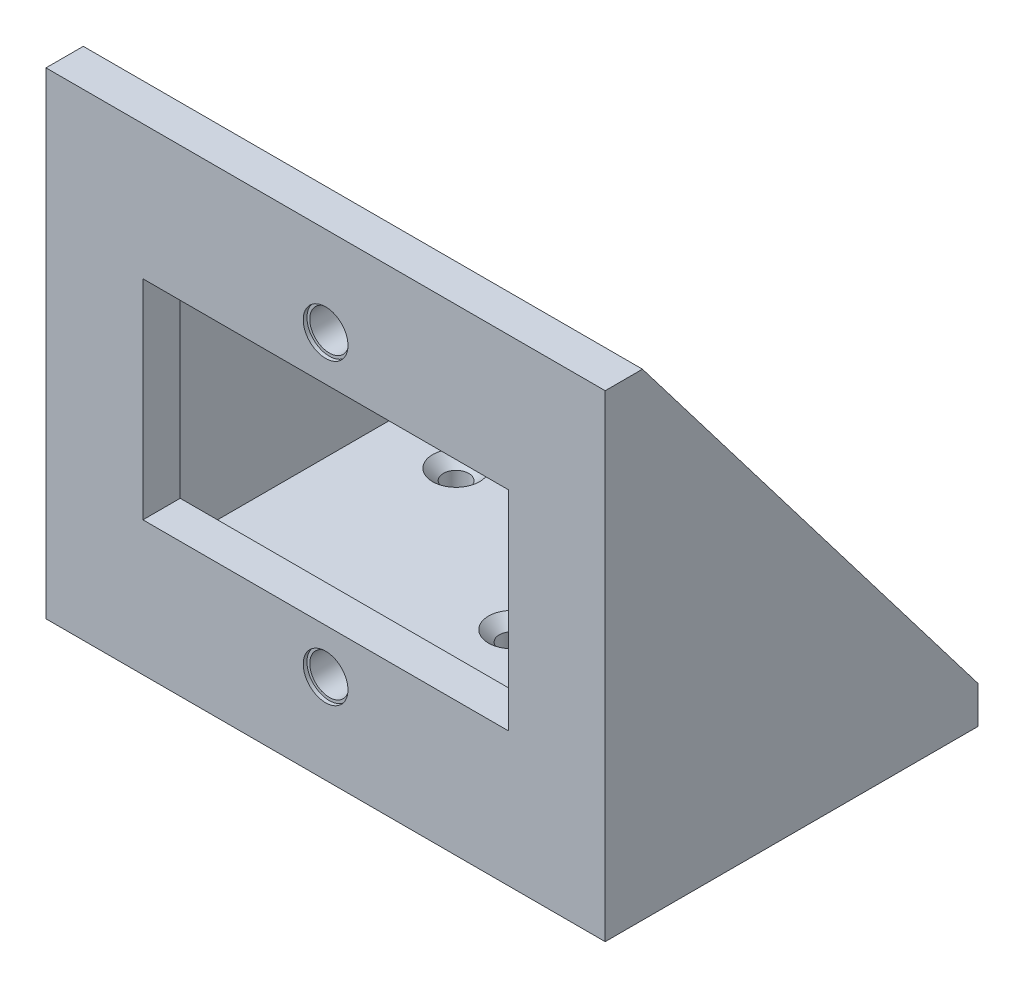
ISO-10303-21;
HEADER;
FILE_DESCRIPTION(('STEP AP214'),'2;1');
FILE_NAME('part.step','',(''),(''),'','','');
FILE_SCHEMA(('AUTOMOTIVE_DESIGN { 1 0 10303 214 1 1 1 1 }'));
ENDSEC;
DATA;
#1=APPLICATION_CONTEXT('core data for automotive mechanical design processes');
#2=APPLICATION_PROTOCOL_DEFINITION('international standard','automotive_design',2000,#1);
#3=PRODUCT_CONTEXT('',#1,'mechanical');
#4=PRODUCT('Part','Part','',(#3));
#5=PRODUCT_RELATED_PRODUCT_CATEGORY('part','',(#4));
#6=PRODUCT_DEFINITION_FORMATION('','',#4);
#7=PRODUCT_DEFINITION_CONTEXT('part definition',#1,'design');
#8=PRODUCT_DEFINITION('design','',#6,#7);
#9=PRODUCT_DEFINITION_SHAPE('','',#8);
#10=(LENGTH_UNIT() NAMED_UNIT(*) SI_UNIT(.MILLI.,.METRE.));
#11=(NAMED_UNIT(*) PLANE_ANGLE_UNIT() SI_UNIT($,.RADIAN.));
#12=(NAMED_UNIT(*) SI_UNIT($,.STERADIAN.) SOLID_ANGLE_UNIT());
#13=UNCERTAINTY_MEASURE_WITH_UNIT(LENGTH_MEASURE(1.E-05),#10,'distance_accuracy_value','');
#14=(GEOMETRIC_REPRESENTATION_CONTEXT(3) GLOBAL_UNCERTAINTY_ASSIGNED_CONTEXT((#13)) GLOBAL_UNIT_ASSIGNED_CONTEXT((#10,
#11,#12)) REPRESENTATION_CONTEXT('',''));
#15=CARTESIAN_POINT('',(0.,0.,0.));
#16=DIRECTION('',(0.,0.,1.));
#17=DIRECTION('',(1.,0.,0.));
#18=AXIS2_PLACEMENT_3D('',#15,#16,#17);
#19=CARTESIAN_POINT('',(0.,5.,0.));
#20=DIRECTION('',(0.,1.,0.));
#21=DIRECTION('',(0.,0.,1.));
#22=AXIS2_PLACEMENT_3D('',#19,#20,#21);
#23=PLANE('',#22);
#24=CARTESIAN_POINT('',(0.,5.,0.));
#25=DIRECTION('',(0.,1.,0.));
#26=DIRECTION('',(0.,0.,1.));
#27=AXIS2_PLACEMENT_3D('',#24,#25,#26);
#28=CIRCLE('',#27,3.15);
#29=CARTESIAN_POINT('',(0.,5.,3.15));
#30=VERTEX_POINT('',#29);
#31=EDGE_CURVE('E389',#30,#30,#28,.T.);
#32=ORIENTED_EDGE('',*,*,#31,.F.);
#33=EDGE_LOOP('',(#32));
#34=FACE_BOUND('',#33,.T.);
#35=CARTESIAN_POINT('',(-22.5,5.,-15.));
#36=DIRECTION('',(0.,1.,0.));
#37=DIRECTION('',(0.,0.,1.));
#38=AXIS2_PLACEMENT_3D('',#35,#36,#37);
#39=CIRCLE('',#38,3.15);
#40=CARTESIAN_POINT('',(-22.5,5.,-11.85));
#41=VERTEX_POINT('',#40);
#42=EDGE_CURVE('E380',#41,#41,#39,.T.);
#43=ORIENTED_EDGE('',*,*,#42,.F.);
#44=EDGE_LOOP('',(#43));
#45=FACE_BOUND('',#44,.T.);
#46=CARTESIAN_POINT('',(-22.5,5.,15.));
#47=DIRECTION('',(0.,1.,0.));
#48=DIRECTION('',(0.,0.,1.));
#49=AXIS2_PLACEMENT_3D('',#46,#47,#48);
#50=CIRCLE('',#49,3.15);
#51=CARTESIAN_POINT('',(-22.5,5.,18.15));
#52=VERTEX_POINT('',#51);
#53=EDGE_CURVE('E371',#52,#52,#50,.T.);
#54=ORIENTED_EDGE('',*,*,#53,.F.);
#55=EDGE_LOOP('',(#54));
#56=FACE_BOUND('',#55,.T.);
#57=CARTESIAN_POINT('',(22.5,5.,15.));
#58=DIRECTION('',(0.,1.,0.));
#59=DIRECTION('',(0.,0.,1.));
#60=AXIS2_PLACEMENT_3D('',#57,#58,#59);
#61=CIRCLE('',#60,3.15);
#62=CARTESIAN_POINT('',(22.5,5.,18.15));
#63=VERTEX_POINT('',#62);
#64=EDGE_CURVE('E362',#63,#63,#61,.T.);
#65=ORIENTED_EDGE('',*,*,#64,.F.);
#66=EDGE_LOOP('',(#65));
#67=FACE_BOUND('',#66,.T.);
#68=CARTESIAN_POINT('',(22.5,5.,-15.));
#69=DIRECTION('',(0.,1.,0.));
#70=DIRECTION('',(0.,0.,1.));
#71=AXIS2_PLACEMENT_3D('',#68,#69,#70);
#72=CIRCLE('',#71,3.15);
#73=CARTESIAN_POINT('',(22.5,5.,-11.85));
#74=VERTEX_POINT('',#73);
#75=EDGE_CURVE('E353',#74,#74,#72,.T.);
#76=ORIENTED_EDGE('',*,*,#75,.F.);
#77=EDGE_LOOP('',(#76));
#78=FACE_BOUND('',#77,.T.);
#79=DIRECTION('',(-1.,0.,0.));
#80=VECTOR('',#79,1.);
#81=CARTESIAN_POINT('',(-37.5,5.,-25.));
#82=LINE('',#81,#80);
#83=CARTESIAN_POINT('',(32.5,5.,-25.));
#84=VERTEX_POINT('',#83);
#85=CARTESIAN_POINT('',(-32.5,5.,-25.));
#86=VERTEX_POINT('',#85);
#87=EDGE_CURVE('E229',#84,#86,#82,.T.);
#88=ORIENTED_EDGE('',*,*,#87,.T.);
#89=DIRECTION('',(0.,0.,-1.));
#90=VECTOR('',#89,1.);
#91=CARTESIAN_POINT('',(-32.5,5.,-25.));
#92=LINE('',#91,#90);
#93=CARTESIAN_POINT('',(-32.5,5.,20.));
#94=VERTEX_POINT('',#93);
#95=EDGE_CURVE('E151',#94,#86,#92,.T.);
#96=ORIENTED_EDGE('',*,*,#95,.F.);
#97=DIRECTION('',(-1.,0.,0.));
#98=VECTOR('',#97,1.);
#99=CARTESIAN_POINT('',(0.,5.,20.));
#100=LINE('',#99,#98);
#101=CARTESIAN_POINT('',(32.5,5.,20.));
#102=VERTEX_POINT('',#101);
#103=EDGE_CURVE('E175',#102,#94,#100,.T.);
#104=ORIENTED_EDGE('',*,*,#103,.F.);
#105=DIRECTION('',(0.,0.,-1.));
#106=VECTOR('',#105,1.);
#107=CARTESIAN_POINT('',(32.5,5.,-25.));
#108=LINE('',#107,#106);
#109=EDGE_CURVE('E314',#102,#84,#108,.T.);
#110=ORIENTED_EDGE('',*,*,#109,.T.);
#111=EDGE_LOOP('',(#88,#96,#104,#110));
#112=FACE_BOUND('',#111,.T.);
#113=ADVANCED_FACE('F56',(#34,#45,#56,#67,#78,#112),#23,.T.);
#114=CARTESIAN_POINT('',(0.,0.,20.));
#115=DIRECTION('',(0.,0.,1.));
#116=DIRECTION('',(1.,0.,0.));
#117=AXIS2_PLACEMENT_3D('',#114,#115,#116);
#118=PLANE('',#117);
#119=CARTESIAN_POINT('',(0.,52.,20.));
#120=DIRECTION('',(0.,0.,1.));
#121=DIRECTION('',(1.,0.,0.));
#122=AXIS2_PLACEMENT_3D('',#119,#120,#121);
#123=CIRCLE('',#122,2.625);
#124=CARTESIAN_POINT('',(2.625,52.,20.));
#125=VERTEX_POINT('',#124);
#126=EDGE_CURVE('E336',#125,#125,#123,.T.);
#127=ORIENTED_EDGE('',*,*,#126,.T.);
#128=EDGE_LOOP('',(#127));
#129=FACE_BOUND('',#128,.T.);
#130=CARTESIAN_POINT('',(0.,12.,20.));
#131=DIRECTION('',(0.,0.,1.));
#132=DIRECTION('',(1.,0.,0.));
#133=AXIS2_PLACEMENT_3D('',#130,#131,#132);
#134=CIRCLE('',#133,2.625);
#135=CARTESIAN_POINT('',(2.62499999999999,12.,20.));
#136=VERTEX_POINT('',#135);
#137=EDGE_CURVE('E323',#136,#136,#134,.T.);
#138=ORIENTED_EDGE('',*,*,#137,.T.);
#139=EDGE_LOOP('',(#138));
#140=FACE_BOUND('',#139,.T.);
#141=DIRECTION('',(1.,0.,0.));
#142=VECTOR('',#141,1.);
#143=CARTESIAN_POINT('',(0.,18.,20.));
#144=LINE('',#143,#142);
#145=CARTESIAN_POINT('',(-24.5,18.,20.));
#146=VERTEX_POINT('',#145);
#147=CARTESIAN_POINT('',(24.5,18.,20.));
#148=VERTEX_POINT('',#147);
#149=EDGE_CURVE('E183',#146,#148,#144,.T.);
#150=ORIENTED_EDGE('',*,*,#149,.T.);
#151=DIRECTION('',(0.,1.,0.));
#152=VECTOR('',#151,1.);
#153=CARTESIAN_POINT('',(24.5,0.,20.));
#154=LINE('',#153,#152);
#155=CARTESIAN_POINT('',(24.5,46.,20.));
#156=VERTEX_POINT('',#155);
#157=EDGE_CURVE('E194',#148,#156,#154,.T.);
#158=ORIENTED_EDGE('',*,*,#157,.T.);
#159=DIRECTION('',(-1.,0.,0.));
#160=VECTOR('',#159,1.);
#161=CARTESIAN_POINT('',(0.,46.,20.));
#162=LINE('',#161,#160);
#163=CARTESIAN_POINT('',(-24.5,46.,20.));
#164=VERTEX_POINT('',#163);
#165=EDGE_CURVE('E192',#156,#164,#162,.T.);
#166=ORIENTED_EDGE('',*,*,#165,.T.);
#167=DIRECTION('',(0.,-1.,0.));
#168=VECTOR('',#167,1.);
#169=CARTESIAN_POINT('',(-24.5,0.,20.));
#170=LINE('',#169,#168);
#171=EDGE_CURVE('E190',#164,#146,#170,.T.);
#172=ORIENTED_EDGE('',*,*,#171,.T.);
#173=EDGE_LOOP('',(#150,#158,#166,#172));
#174=FACE_BOUND('',#173,.T.);
#175=DIRECTION('',(0.,-1.,0.));
#176=VECTOR('',#175,1.);
#177=CARTESIAN_POINT('',(-32.5,5.,20.));
#178=LINE('',#177,#176);
#179=CARTESIAN_POINT('',(-32.5,64.,20.));
#180=VERTEX_POINT('',#179);
#181=EDGE_CURVE('E149',#180,#94,#178,.T.);
#182=ORIENTED_EDGE('',*,*,#181,.F.);
#183=DIRECTION('',(-1.,0.,0.));
#184=VECTOR('',#183,1.);
#185=CARTESIAN_POINT('',(0.,64.,20.));
#186=LINE('',#185,#184);
#187=CARTESIAN_POINT('',(32.5,64.,20.));
#188=VERTEX_POINT('',#187);
#189=EDGE_CURVE('E172',#188,#180,#186,.T.);
#190=ORIENTED_EDGE('',*,*,#189,.F.);
#191=DIRECTION('',(0.,-1.,0.));
#192=VECTOR('',#191,1.);
#193=CARTESIAN_POINT('',(32.5,5.,20.));
#194=LINE('',#193,#192);
#195=EDGE_CURVE('E315',#188,#102,#194,.T.);
#196=ORIENTED_EDGE('',*,*,#195,.T.);
#197=ORIENTED_EDGE('',*,*,#103,.T.);
#198=EDGE_LOOP('',(#182,#190,#196,#197));
#199=FACE_BOUND('',#198,.T.);
#200=ADVANCED_FACE('F170',(#129,#140,#174,#199),#118,.F.);
#201=CARTESIAN_POINT('',(37.5,5.,-25.));
#202=DIRECTION('',(-1.,0.,0.));
#203=DIRECTION('',(0.,0.,1.));
#204=AXIS2_PLACEMENT_3D('',#201,#202,#203);
#205=PLANE('',#204);
#206=DIRECTION('',(0.,-1.,0.));
#207=VECTOR('',#206,1.);
#208=CARTESIAN_POINT('',(37.5,5.,-25.));
#209=LINE('',#208,#207);
#210=CARTESIAN_POINT('',(37.5,5.,-25.));
#211=VERTEX_POINT('',#210);
#212=CARTESIAN_POINT('',(37.5,0.,-25.));
#213=VERTEX_POINT('',#212);
#214=EDGE_CURVE('E12',#211,#213,#209,.T.);
#215=ORIENTED_EDGE('',*,*,#214,.F.);
#216=DIRECTION('',(0.,0.795122252877777,0.606449175923728));
#217=VECTOR('',#216,1.);
#218=CARTESIAN_POINT('',(37.5,64.,20.));
#219=LINE('',#218,#217);
#220=CARTESIAN_POINT('',(37.5,64.,20.));
#221=VERTEX_POINT('',#220);
#222=EDGE_CURVE('E164',#211,#221,#219,.T.);
#223=ORIENTED_EDGE('',*,*,#222,.T.);
#224=DIRECTION('',(0.,0.,1.));
#225=VECTOR('',#224,1.);
#226=CARTESIAN_POINT('',(37.5,64.,20.));
#227=LINE('',#226,#225);
#228=CARTESIAN_POINT('',(37.5,64.,25.));
#229=VERTEX_POINT('',#228);
#230=EDGE_CURVE('E196',#221,#229,#227,.T.);
#231=ORIENTED_EDGE('',*,*,#230,.T.);
#232=DIRECTION('',(0.,-1.,0.));
#233=VECTOR('',#232,1.);
#234=CARTESIAN_POINT('',(37.5,5.,25.));
#235=LINE('',#234,#233);
#236=CARTESIAN_POINT('',(37.5,0.,25.));
#237=VERTEX_POINT('',#236);
#238=EDGE_CURVE('E228',#229,#237,#235,.T.);
#239=ORIENTED_EDGE('',*,*,#238,.T.);
#240=DIRECTION('',(0.,0.,-1.));
#241=VECTOR('',#240,1.);
#242=CARTESIAN_POINT('',(37.5,0.,-25.));
#243=LINE('',#242,#241);
#244=EDGE_CURVE('E212',#237,#213,#243,.T.);
#245=ORIENTED_EDGE('',*,*,#244,.T.);
#246=EDGE_LOOP('',(#215,#223,#231,#239,#245));
#247=FACE_BOUND('',#246,.T.);
#248=ADVANCED_FACE('F58',(#247),#205,.F.);
#249=CARTESIAN_POINT('',(-37.5,5.,-25.));
#250=DIRECTION('',(0.,0.,1.));
#251=DIRECTION('',(1.,0.,0.));
#252=AXIS2_PLACEMENT_3D('',#249,#250,#251);
#253=PLANE('',#252);
#254=DIRECTION('',(-1.,0.,0.));
#255=VECTOR('',#254,1.);
#256=CARTESIAN_POINT('',(-37.5,0.,-25.));
#257=LINE('',#256,#255);
#258=CARTESIAN_POINT('',(-37.5,0.,-25.));
#259=VERTEX_POINT('',#258);
#260=EDGE_CURVE('E232',#213,#259,#257,.T.);
#261=ORIENTED_EDGE('',*,*,#260,.T.);
#262=DIRECTION('',(0.,-1.,0.));
#263=VECTOR('',#262,1.);
#264=CARTESIAN_POINT('',(-37.5,5.,-25.));
#265=LINE('',#264,#263);
#266=CARTESIAN_POINT('',(-37.5,5.,-25.));
#267=VERTEX_POINT('',#266);
#268=EDGE_CURVE('E64',#267,#259,#265,.T.);
#269=ORIENTED_EDGE('',*,*,#268,.F.);
#270=DIRECTION('',(-1.,0.,0.));
#271=VECTOR('',#270,1.);
#272=CARTESIAN_POINT('',(-32.5,5.,-25.));
#273=LINE('',#272,#271);
#274=EDGE_CURVE('E165',#86,#267,#273,.T.);
#275=ORIENTED_EDGE('',*,*,#274,.F.);
#276=ORIENTED_EDGE('',*,*,#87,.F.);
#277=EDGE_CURVE('E226',#211,#84,#82,.T.);
#278=ORIENTED_EDGE('',*,*,#277,.F.);
#279=ORIENTED_EDGE('',*,*,#214,.T.);
#280=EDGE_LOOP('',(#261,#269,#275,#276,#278,#279));
#281=FACE_BOUND('',#280,.T.);
#282=ADVANCED_FACE('F277',(#281),#253,.F.);
#283=CARTESIAN_POINT('',(-37.5,5.,-25.));
#284=DIRECTION('',(1.,0.,0.));
#285=DIRECTION('',(0.,0.,-1.));
#286=AXIS2_PLACEMENT_3D('',#283,#284,#285);
#287=PLANE('',#286);
#288=DIRECTION('',(0.,0.,1.));
#289=VECTOR('',#288,1.);
#290=CARTESIAN_POINT('',(-37.5,64.,20.));
#291=LINE('',#290,#289);
#292=CARTESIAN_POINT('',(-37.5,64.,20.));
#293=VERTEX_POINT('',#292);
#294=CARTESIAN_POINT('',(-37.5,64.,25.));
#295=VERTEX_POINT('',#294);
#296=EDGE_CURVE('E222',#293,#295,#291,.T.);
#297=ORIENTED_EDGE('',*,*,#296,.F.);
#298=DIRECTION('',(0.,0.795122252877777,0.606449175923728));
#299=VECTOR('',#298,1.);
#300=CARTESIAN_POINT('',(-37.5,5.,-25.));
#301=LINE('',#300,#299);
#302=EDGE_CURVE('E154',#267,#293,#301,.T.);
#303=ORIENTED_EDGE('',*,*,#302,.F.);
#304=ORIENTED_EDGE('',*,*,#268,.T.);
#305=DIRECTION('',(0.,0.,1.));
#306=VECTOR('',#305,1.);
#307=CARTESIAN_POINT('',(-37.5,0.,-25.));
#308=LINE('',#307,#306);
#309=CARTESIAN_POINT('',(-37.5,0.,25.));
#310=VERTEX_POINT('',#309);
#311=EDGE_CURVE('E79',#259,#310,#308,.T.);
#312=ORIENTED_EDGE('',*,*,#311,.T.);
#313=DIRECTION('',(0.,-1.,0.));
#314=VECTOR('',#313,1.);
#315=CARTESIAN_POINT('',(-37.5,5.,25.));
#316=LINE('',#315,#314);
#317=EDGE_CURVE('E237',#295,#310,#316,.T.);
#318=ORIENTED_EDGE('',*,*,#317,.F.);
#319=EDGE_LOOP('',(#297,#303,#304,#312,#318));
#320=FACE_BOUND('',#319,.T.);
#321=ADVANCED_FACE('F239',(#320),#287,.F.);
#322=CARTESIAN_POINT('',(-37.5,5.,25.));
#323=DIRECTION('',(0.,0.,-1.));
#324=DIRECTION('',(-1.,0.,0.));
#325=AXIS2_PLACEMENT_3D('',#322,#323,#324);
#326=PLANE('',#325);
#327=CARTESIAN_POINT('',(0.,52.,25.));
#328=DIRECTION('',(0.,0.,1.));
#329=DIRECTION('',(1.,0.,0.));
#330=AXIS2_PLACEMENT_3D('',#327,#328,#329);
#331=CIRCLE('',#330,3.);
#332=CARTESIAN_POINT('',(3.,52.,25.));
#333=VERTEX_POINT('',#332);
#334=EDGE_CURVE('E344',#333,#333,#331,.T.);
#335=ORIENTED_EDGE('',*,*,#334,.F.);
#336=EDGE_LOOP('',(#335));
#337=FACE_BOUND('',#336,.T.);
#338=CARTESIAN_POINT('',(0.,12.,25.));
#339=DIRECTION('',(0.,0.,1.));
#340=DIRECTION('',(1.,0.,0.));
#341=AXIS2_PLACEMENT_3D('',#338,#339,#340);
#342=CIRCLE('',#341,3.);
#343=CARTESIAN_POINT('',(2.99999999999999,12.,25.));
#344=VERTEX_POINT('',#343);
#345=EDGE_CURVE('E333',#344,#344,#342,.T.);
#346=ORIENTED_EDGE('',*,*,#345,.F.);
#347=EDGE_LOOP('',(#346));
#348=FACE_BOUND('',#347,.T.);
#349=DIRECTION('',(1.,0.,0.));
#350=VECTOR('',#349,1.);
#351=CARTESIAN_POINT('',(-37.5,0.,25.));
#352=LINE('',#351,#350);
#353=EDGE_CURVE('E71',#310,#237,#352,.T.);
#354=ORIENTED_EDGE('',*,*,#353,.T.);
#355=ORIENTED_EDGE('',*,*,#238,.F.);
#356=DIRECTION('',(-1.,0.,0.));
#357=VECTOR('',#356,1.);
#358=CARTESIAN_POINT('',(0.,64.,25.));
#359=LINE('',#358,#357);
#360=EDGE_CURVE('E197',#229,#295,#359,.T.);
#361=ORIENTED_EDGE('',*,*,#360,.T.);
#362=ORIENTED_EDGE('',*,*,#317,.T.);
#363=EDGE_LOOP('',(#354,#355,#361,#362));
#364=FACE_BOUND('',#363,.T.);
#365=DIRECTION('',(1.,0.,0.));
#366=VECTOR('',#365,1.);
#367=CARTESIAN_POINT('',(0.,18.,25.));
#368=LINE('',#367,#366);
#369=CARTESIAN_POINT('',(-24.5,18.,25.));
#370=VERTEX_POINT('',#369);
#371=CARTESIAN_POINT('',(24.5,18.,25.));
#372=VERTEX_POINT('',#371);
#373=EDGE_CURVE('E200',#370,#372,#368,.T.);
#374=ORIENTED_EDGE('',*,*,#373,.F.);
#375=DIRECTION('',(0.,-1.,0.));
#376=VECTOR('',#375,1.);
#377=CARTESIAN_POINT('',(-24.5,0.,25.));
#378=LINE('',#377,#376);
#379=CARTESIAN_POINT('',(-24.5,46.,25.));
#380=VERTEX_POINT('',#379);
#381=EDGE_CURVE('E204',#380,#370,#378,.T.);
#382=ORIENTED_EDGE('',*,*,#381,.F.);
#383=DIRECTION('',(-1.,0.,0.));
#384=VECTOR('',#383,1.);
#385=CARTESIAN_POINT('',(0.,46.,25.));
#386=LINE('',#385,#384);
#387=CARTESIAN_POINT('',(24.5,46.,25.));
#388=VERTEX_POINT('',#387);
#389=EDGE_CURVE('E206',#388,#380,#386,.T.);
#390=ORIENTED_EDGE('',*,*,#389,.F.);
#391=DIRECTION('',(0.,1.,0.));
#392=VECTOR('',#391,1.);
#393=CARTESIAN_POINT('',(24.5,0.,25.));
#394=LINE('',#393,#392);
#395=EDGE_CURVE('E184',#372,#388,#394,.T.);
#396=ORIENTED_EDGE('',*,*,#395,.F.);
#397=EDGE_LOOP('',(#374,#382,#390,#396));
#398=FACE_BOUND('',#397,.T.);
#399=ADVANCED_FACE('F246',(#337,#348,#364,#398),#326,.F.);
#400=CARTESIAN_POINT('',(0.,0.,0.));
#401=DIRECTION('',(0.,1.,0.));
#402=DIRECTION('',(0.,0.,1.));
#403=AXIS2_PLACEMENT_3D('',#400,#401,#402);
#404=PLANE('',#403);
#405=CARTESIAN_POINT('',(0.,0.,0.));
#406=DIRECTION('',(0.,1.,0.));
#407=DIRECTION('',(0.,0.,1.));
#408=AXIS2_PLACEMENT_3D('',#405,#406,#407);
#409=CIRCLE('',#408,1.69999999999999);
#410=CARTESIAN_POINT('',(0.,0.,1.69999999999999));
#411=VERTEX_POINT('',#410);
#412=EDGE_CURVE('E383',#411,#411,#409,.T.);
#413=ORIENTED_EDGE('',*,*,#412,.T.);
#414=EDGE_LOOP('',(#413));
#415=FACE_BOUND('',#414,.T.);
#416=CARTESIAN_POINT('',(-22.5,0.,-15.));
#417=DIRECTION('',(0.,1.,0.));
#418=DIRECTION('',(0.,0.,1.));
#419=AXIS2_PLACEMENT_3D('',#416,#417,#418);
#420=CIRCLE('',#419,1.69999999999999);
#421=CARTESIAN_POINT('',(-22.5,0.,-13.3));
#422=VERTEX_POINT('',#421);
#423=EDGE_CURVE('E374',#422,#422,#420,.T.);
#424=ORIENTED_EDGE('',*,*,#423,.T.);
#425=EDGE_LOOP('',(#424));
#426=FACE_BOUND('',#425,.T.);
#427=CARTESIAN_POINT('',(-22.5,0.,15.));
#428=DIRECTION('',(0.,1.,0.));
#429=DIRECTION('',(0.,0.,1.));
#430=AXIS2_PLACEMENT_3D('',#427,#428,#429);
#431=CIRCLE('',#430,1.69999999999999);
#432=CARTESIAN_POINT('',(-22.5,0.,16.7));
#433=VERTEX_POINT('',#432);
#434=EDGE_CURVE('E365',#433,#433,#431,.T.);
#435=ORIENTED_EDGE('',*,*,#434,.T.);
#436=EDGE_LOOP('',(#435));
#437=FACE_BOUND('',#436,.T.);
#438=CARTESIAN_POINT('',(22.5,0.,15.));
#439=DIRECTION('',(0.,1.,0.));
#440=DIRECTION('',(0.,0.,1.));
#441=AXIS2_PLACEMENT_3D('',#438,#439,#440);
#442=CIRCLE('',#441,1.69999999999999);
#443=CARTESIAN_POINT('',(22.5,0.,16.7));
#444=VERTEX_POINT('',#443);
#445=EDGE_CURVE('E356',#444,#444,#442,.T.);
#446=ORIENTED_EDGE('',*,*,#445,.T.);
#447=EDGE_LOOP('',(#446));
#448=FACE_BOUND('',#447,.T.);
#449=CARTESIAN_POINT('',(22.5,0.,-15.));
#450=DIRECTION('',(0.,1.,0.));
#451=DIRECTION('',(0.,0.,1.));
#452=AXIS2_PLACEMENT_3D('',#449,#450,#451);
#453=CIRCLE('',#452,1.69999999999999);
#454=CARTESIAN_POINT('',(22.5,0.,-13.3));
#455=VERTEX_POINT('',#454);
#456=EDGE_CURVE('E347',#455,#455,#453,.T.);
#457=ORIENTED_EDGE('',*,*,#456,.T.);
#458=EDGE_LOOP('',(#457));
#459=FACE_BOUND('',#458,.T.);
#460=ORIENTED_EDGE('',*,*,#244,.F.);
#461=ORIENTED_EDGE('',*,*,#353,.F.);
#462=ORIENTED_EDGE('',*,*,#311,.F.);
#463=ORIENTED_EDGE('',*,*,#260,.F.);
#464=EDGE_LOOP('',(#460,#461,#462,#463));
#465=FACE_BOUND('',#464,.T.);
#466=ADVANCED_FACE('F243',(#415,#426,#437,#448,#459,#465),#404,.F.);
#467=CARTESIAN_POINT('',(0.,18.,20.));
#468=DIRECTION('',(0.,-1.,0.));
#469=DIRECTION('',(1.,0.,0.));
#470=AXIS2_PLACEMENT_3D('',#467,#468,#469);
#471=PLANE('',#470);
#472=ORIENTED_EDGE('',*,*,#373,.T.);
#473=DIRECTION('',(0.,0.,1.));
#474=VECTOR('',#473,1.);
#475=CARTESIAN_POINT('',(24.5,18.,20.));
#476=LINE('',#475,#474);
#477=EDGE_CURVE('E209',#148,#372,#476,.T.);
#478=ORIENTED_EDGE('',*,*,#477,.F.);
#479=ORIENTED_EDGE('',*,*,#149,.F.);
#480=DIRECTION('',(0.,0.,1.));
#481=VECTOR('',#480,1.);
#482=CARTESIAN_POINT('',(-24.5,18.,20.));
#483=LINE('',#482,#481);
#484=EDGE_CURVE('E219',#146,#370,#483,.T.);
#485=ORIENTED_EDGE('',*,*,#484,.T.);
#486=EDGE_LOOP('',(#472,#478,#479,#485));
#487=FACE_BOUND('',#486,.T.);
#488=ADVANCED_FACE('F256',(#487),#471,.F.);
#489=CARTESIAN_POINT('',(24.5,0.,20.));
#490=DIRECTION('',(1.,0.,0.));
#491=DIRECTION('',(0.,1.,0.));
#492=AXIS2_PLACEMENT_3D('',#489,#490,#491);
#493=PLANE('',#492);
#494=ORIENTED_EDGE('',*,*,#395,.T.);
#495=DIRECTION('',(0.,0.,1.));
#496=VECTOR('',#495,1.);
#497=CARTESIAN_POINT('',(24.5,46.,20.));
#498=LINE('',#497,#496);
#499=EDGE_CURVE('E213',#156,#388,#498,.T.);
#500=ORIENTED_EDGE('',*,*,#499,.F.);
#501=ORIENTED_EDGE('',*,*,#157,.F.);
#502=ORIENTED_EDGE('',*,*,#477,.T.);
#503=EDGE_LOOP('',(#494,#500,#501,#502));
#504=FACE_BOUND('',#503,.T.);
#505=ADVANCED_FACE('F268',(#504),#493,.F.);
#506=CARTESIAN_POINT('',(0.,46.,20.));
#507=DIRECTION('',(0.,1.,0.));
#508=DIRECTION('',(-1.,0.,0.));
#509=AXIS2_PLACEMENT_3D('',#506,#507,#508);
#510=PLANE('',#509);
#511=ORIENTED_EDGE('',*,*,#389,.T.);
#512=DIRECTION('',(0.,0.,1.));
#513=VECTOR('',#512,1.);
#514=CARTESIAN_POINT('',(-24.5,46.,20.));
#515=LINE('',#514,#513);
#516=EDGE_CURVE('E216',#164,#380,#515,.T.);
#517=ORIENTED_EDGE('',*,*,#516,.F.);
#518=ORIENTED_EDGE('',*,*,#165,.F.);
#519=ORIENTED_EDGE('',*,*,#499,.T.);
#520=EDGE_LOOP('',(#511,#517,#518,#519));
#521=FACE_BOUND('',#520,.T.);
#522=ADVANCED_FACE('F265',(#521),#510,.F.);
#523=CARTESIAN_POINT('',(0.,64.,20.));
#524=DIRECTION('',(0.,1.,0.));
#525=DIRECTION('',(0.,0.,1.));
#526=AXIS2_PLACEMENT_3D('',#523,#524,#525);
#527=PLANE('',#526);
#528=ORIENTED_EDGE('',*,*,#360,.F.);
#529=ORIENTED_EDGE('',*,*,#230,.F.);
#530=EDGE_CURVE('E181',#221,#188,#186,.T.);
#531=ORIENTED_EDGE('',*,*,#530,.T.);
#532=ORIENTED_EDGE('',*,*,#189,.T.);
#533=DIRECTION('',(-1.,0.,0.));
#534=VECTOR('',#533,1.);
#535=CARTESIAN_POINT('',(-32.5,64.,20.));
#536=LINE('',#535,#534);
#537=EDGE_CURVE('E157',#180,#293,#536,.T.);
#538=ORIENTED_EDGE('',*,*,#537,.T.);
#539=ORIENTED_EDGE('',*,*,#296,.T.);
#540=EDGE_LOOP('',(#528,#529,#531,#532,#538,#539));
#541=FACE_BOUND('',#540,.T.);
#542=ADVANCED_FACE('F178',(#541),#527,.T.);
#543=CARTESIAN_POINT('',(-24.5,0.,20.));
#544=DIRECTION('',(-1.,0.,0.));
#545=DIRECTION('',(0.,-1.,0.));
#546=AXIS2_PLACEMENT_3D('',#543,#544,#545);
#547=PLANE('',#546);
#548=ORIENTED_EDGE('',*,*,#381,.T.);
#549=ORIENTED_EDGE('',*,*,#484,.F.);
#550=ORIENTED_EDGE('',*,*,#171,.F.);
#551=ORIENTED_EDGE('',*,*,#516,.T.);
#552=EDGE_LOOP('',(#548,#549,#550,#551));
#553=FACE_BOUND('',#552,.T.);
#554=ADVANCED_FACE('F261',(#553),#547,.F.);
#555=CARTESIAN_POINT('',(32.5,64.,20.));
#556=DIRECTION('',(0.,0.606449175923728,-0.795122252877777));
#557=DIRECTION('',(0.,0.795122252877777,0.606449175923728));
#558=AXIS2_PLACEMENT_3D('',#555,#556,#557);
#559=PLANE('',#558);
#560=ORIENTED_EDGE('',*,*,#222,.F.);
#561=ORIENTED_EDGE('',*,*,#277,.T.);
#562=DIRECTION('',(0.,0.795122252877777,0.606449175923728));
#563=VECTOR('',#562,1.);
#564=CARTESIAN_POINT('',(32.5,64.,20.));
#565=LINE('',#564,#563);
#566=EDGE_CURVE('E201',#84,#188,#565,.T.);
#567=ORIENTED_EDGE('',*,*,#566,.T.);
#568=ORIENTED_EDGE('',*,*,#530,.F.);
#569=EDGE_LOOP('',(#560,#561,#567,#568));
#570=FACE_BOUND('',#569,.T.);
#571=ADVANCED_FACE('F285',(#570),#559,.T.);
#572=CARTESIAN_POINT('',(32.5,0.,0.));
#573=DIRECTION('',(1.,0.,0.));
#574=DIRECTION('',(0.,0.,-1.));
#575=AXIS2_PLACEMENT_3D('',#572,#573,#574);
#576=PLANE('',#575);
#577=ORIENTED_EDGE('',*,*,#195,.F.);
#578=ORIENTED_EDGE('',*,*,#566,.F.);
#579=ORIENTED_EDGE('',*,*,#109,.F.);
#580=EDGE_LOOP('',(#577,#578,#579));
#581=FACE_BOUND('',#580,.T.);
#582=ADVANCED_FACE('F313',(#581),#576,.F.);
#583=CARTESIAN_POINT('',(-32.5,5.,-25.));
#584=DIRECTION('',(0.,-0.606449175923728,0.795122252877777));
#585=DIRECTION('',(0.,-0.795122252877777,-0.606449175923728));
#586=AXIS2_PLACEMENT_3D('',#583,#584,#585);
#587=PLANE('',#586);
#588=ORIENTED_EDGE('',*,*,#302,.T.);
#589=ORIENTED_EDGE('',*,*,#537,.F.);
#590=DIRECTION('',(0.,0.795122252877777,0.606449175923728));
#591=VECTOR('',#590,1.);
#592=CARTESIAN_POINT('',(-32.5,5.,-25.));
#593=LINE('',#592,#591);
#594=EDGE_CURVE('E145',#86,#180,#593,.T.);
#595=ORIENTED_EDGE('',*,*,#594,.F.);
#596=ORIENTED_EDGE('',*,*,#274,.T.);
#597=EDGE_LOOP('',(#588,#589,#595,#596));
#598=FACE_BOUND('',#597,.T.);
#599=ADVANCED_FACE('F158',(#598),#587,.F.);
#600=CARTESIAN_POINT('',(-32.5,0.,0.));
#601=DIRECTION('',(-1.,0.,0.));
#602=DIRECTION('',(0.,0.,1.));
#603=AXIS2_PLACEMENT_3D('',#600,#601,#602);
#604=PLANE('',#603);
#605=ORIENTED_EDGE('',*,*,#594,.T.);
#606=ORIENTED_EDGE('',*,*,#181,.T.);
#607=ORIENTED_EDGE('',*,*,#95,.T.);
#608=EDGE_LOOP('',(#605,#606,#607));
#609=FACE_BOUND('',#608,.T.);
#610=ADVANCED_FACE('F147',(#609),#604,.F.);
#611=CARTESIAN_POINT('',(0.,12.,25.));
#612=DIRECTION('',(0.,0.,1.));
#613=DIRECTION('',(1.,0.,0.));
#614=AXIS2_PLACEMENT_3D('',#611,#612,#613);
#615=CYLINDRICAL_SURFACE('',#614,2.625);
#616=ORIENTED_EDGE('',*,*,#137,.F.);
#617=EDGE_LOOP('',(#616));
#618=FACE_BOUND('',#617,.T.);
#619=CARTESIAN_POINT('',(0.,12.,24.5));
#620=DIRECTION('',(0.,0.,1.));
#621=DIRECTION('',(1.,0.,0.));
#622=AXIS2_PLACEMENT_3D('',#619,#620,#621);
#623=CIRCLE('',#622,2.625);
#624=CARTESIAN_POINT('',(2.62499999999999,12.,24.5));
#625=VERTEX_POINT('',#624);
#626=EDGE_CURVE('E327',#625,#625,#623,.T.);
#627=ORIENTED_EDGE('',*,*,#626,.T.);
#628=EDGE_LOOP('',(#627));
#629=FACE_BOUND('',#628,.T.);
#630=ADVANCED_FACE('F440',(#618,#629),#615,.F.);
#631=CARTESIAN_POINT('',(2.62499999999999,12.,24.5));
#632=DIRECTION('',(0.,0.,-1.));
#633=DIRECTION('',(-1.,0.,0.));
#634=AXIS2_PLACEMENT_3D('',#631,#632,#633);
#635=PLANE('',#634);
#636=ORIENTED_EDGE('',*,*,#626,.F.);
#637=EDGE_LOOP('',(#636));
#638=FACE_BOUND('',#637,.T.);
#639=CARTESIAN_POINT('',(0.,12.,24.5));
#640=DIRECTION('',(0.,0.,1.));
#641=DIRECTION('',(1.,0.,0.));
#642=AXIS2_PLACEMENT_3D('',#639,#640,#641);
#643=CIRCLE('',#642,3.);
#644=CARTESIAN_POINT('',(2.99999999999999,12.,24.5));
#645=VERTEX_POINT('',#644);
#646=EDGE_CURVE('E330',#645,#645,#643,.T.);
#647=ORIENTED_EDGE('',*,*,#646,.T.);
#648=EDGE_LOOP('',(#647));
#649=FACE_BOUND('',#648,.T.);
#650=ADVANCED_FACE('F436',(#638,#649),#635,.F.);
#651=CARTESIAN_POINT('',(0.,12.,25.));
#652=DIRECTION('',(0.,0.,1.));
#653=DIRECTION('',(1.,0.,0.));
#654=AXIS2_PLACEMENT_3D('',#651,#652,#653);
#655=CYLINDRICAL_SURFACE('',#654,3.);
#656=ORIENTED_EDGE('',*,*,#646,.F.);
#657=EDGE_LOOP('',(#656));
#658=FACE_BOUND('',#657,.T.);
#659=ORIENTED_EDGE('',*,*,#345,.T.);
#660=EDGE_LOOP('',(#659));
#661=FACE_BOUND('',#660,.T.);
#662=ADVANCED_FACE('F432',(#658,#661),#655,.F.);
#663=CARTESIAN_POINT('',(0.,52.,25.));
#664=DIRECTION('',(0.,0.,1.));
#665=DIRECTION('',(1.,0.,0.));
#666=AXIS2_PLACEMENT_3D('',#663,#664,#665);
#667=CYLINDRICAL_SURFACE('',#666,2.625);
#668=ORIENTED_EDGE('',*,*,#126,.F.);
#669=EDGE_LOOP('',(#668));
#670=FACE_BOUND('',#669,.T.);
#671=CARTESIAN_POINT('',(0.,52.,24.5));
#672=DIRECTION('',(0.,0.,1.));
#673=DIRECTION('',(1.,0.,0.));
#674=AXIS2_PLACEMENT_3D('',#671,#672,#673);
#675=CIRCLE('',#674,2.625);
#676=CARTESIAN_POINT('',(2.625,52.,24.5));
#677=VERTEX_POINT('',#676);
#678=EDGE_CURVE('E338',#677,#677,#675,.T.);
#679=ORIENTED_EDGE('',*,*,#678,.T.);
#680=EDGE_LOOP('',(#679));
#681=FACE_BOUND('',#680,.T.);
#682=ADVANCED_FACE('F428',(#670,#681),#667,.F.);
#683=CARTESIAN_POINT('',(2.625,52.,24.5));
#684=DIRECTION('',(0.,0.,-1.));
#685=DIRECTION('',(-1.,0.,0.));
#686=AXIS2_PLACEMENT_3D('',#683,#684,#685);
#687=PLANE('',#686);
#688=ORIENTED_EDGE('',*,*,#678,.F.);
#689=EDGE_LOOP('',(#688));
#690=FACE_BOUND('',#689,.T.);
#691=CARTESIAN_POINT('',(0.,52.,24.5));
#692=DIRECTION('',(0.,0.,1.));
#693=DIRECTION('',(1.,0.,0.));
#694=AXIS2_PLACEMENT_3D('',#691,#692,#693);
#695=CIRCLE('',#694,3.);
#696=CARTESIAN_POINT('',(3.,52.,24.5));
#697=VERTEX_POINT('',#696);
#698=EDGE_CURVE('E341',#697,#697,#695,.T.);
#699=ORIENTED_EDGE('',*,*,#698,.T.);
#700=EDGE_LOOP('',(#699));
#701=FACE_BOUND('',#700,.T.);
#702=ADVANCED_FACE('F424',(#690,#701),#687,.F.);
#703=CARTESIAN_POINT('',(0.,52.,25.));
#704=DIRECTION('',(0.,0.,1.));
#705=DIRECTION('',(1.,0.,0.));
#706=AXIS2_PLACEMENT_3D('',#703,#704,#705);
#707=CYLINDRICAL_SURFACE('',#706,3.);
#708=ORIENTED_EDGE('',*,*,#698,.F.);
#709=EDGE_LOOP('',(#708));
#710=FACE_BOUND('',#709,.T.);
#711=ORIENTED_EDGE('',*,*,#334,.T.);
#712=EDGE_LOOP('',(#711));
#713=FACE_BOUND('',#712,.T.);
#714=ADVANCED_FACE('F416',(#710,#713),#707,.F.);
#715=CARTESIAN_POINT('',(22.5,5.,-15.));
#716=DIRECTION('',(0.,1.,0.));
#717=DIRECTION('',(0.,0.,1.));
#718=AXIS2_PLACEMENT_3D('',#715,#716,#717);
#719=CYLINDRICAL_SURFACE('',#718,1.69999999999999);
#720=ORIENTED_EDGE('',*,*,#456,.F.);
#721=EDGE_LOOP('',(#720));
#722=FACE_BOUND('',#721,.T.);
#723=CARTESIAN_POINT('',(22.5,3.55,-15.));
#724=DIRECTION('',(0.,1.,0.));
#725=DIRECTION('',(0.,0.,1.));
#726=AXIS2_PLACEMENT_3D('',#723,#724,#725);
#727=CIRCLE('',#726,1.7);
#728=CARTESIAN_POINT('',(22.5,3.55,-13.3));
#729=VERTEX_POINT('',#728);
#730=EDGE_CURVE('E350',#729,#729,#727,.T.);
#731=ORIENTED_EDGE('',*,*,#730,.T.);
#732=EDGE_LOOP('',(#731));
#733=FACE_BOUND('',#732,.T.);
#734=ADVANCED_FACE('F406',(#722,#733),#719,.F.);
#735=CARTESIAN_POINT('',(22.5,5.,-15.));
#736=DIRECTION('',(0.,1.,0.));
#737=DIRECTION('',(0.,0.,1.));
#738=AXIS2_PLACEMENT_3D('',#735,#736,#737);
#739=CONICAL_SURFACE('',#738,3.15,0.785398163397447);
#740=ORIENTED_EDGE('',*,*,#730,.F.);
#741=EDGE_LOOP('',(#740));
#742=FACE_BOUND('',#741,.T.);
#743=ORIENTED_EDGE('',*,*,#75,.T.);
#744=EDGE_LOOP('',(#743));
#745=FACE_BOUND('',#744,.T.);
#746=ADVANCED_FACE('F403',(#742,#745),#739,.F.);
#747=CARTESIAN_POINT('',(22.5,5.,15.));
#748=DIRECTION('',(0.,1.,0.));
#749=DIRECTION('',(0.,0.,1.));
#750=AXIS2_PLACEMENT_3D('',#747,#748,#749);
#751=CYLINDRICAL_SURFACE('',#750,1.69999999999999);
#752=ORIENTED_EDGE('',*,*,#445,.F.);
#753=EDGE_LOOP('',(#752));
#754=FACE_BOUND('',#753,.T.);
#755=CARTESIAN_POINT('',(22.5,3.55,15.));
#756=DIRECTION('',(0.,1.,0.));
#757=DIRECTION('',(0.,0.,1.));
#758=AXIS2_PLACEMENT_3D('',#755,#756,#757);
#759=CIRCLE('',#758,1.7);
#760=CARTESIAN_POINT('',(22.5,3.55,16.7));
#761=VERTEX_POINT('',#760);
#762=EDGE_CURVE('E359',#761,#761,#759,.T.);
#763=ORIENTED_EDGE('',*,*,#762,.T.);
#764=EDGE_LOOP('',(#763));
#765=FACE_BOUND('',#764,.T.);
#766=ADVANCED_FACE('F405',(#754,#765),#751,.F.);
#767=CARTESIAN_POINT('',(22.5,5.,15.));
#768=DIRECTION('',(0.,1.,0.));
#769=DIRECTION('',(0.,0.,1.));
#770=AXIS2_PLACEMENT_3D('',#767,#768,#769);
#771=CONICAL_SURFACE('',#770,3.15,0.785398163397447);
#772=ORIENTED_EDGE('',*,*,#762,.F.);
#773=EDGE_LOOP('',(#772));
#774=FACE_BOUND('',#773,.T.);
#775=ORIENTED_EDGE('',*,*,#64,.T.);
#776=EDGE_LOOP('',(#775));
#777=FACE_BOUND('',#776,.T.);
#778=ADVANCED_FACE('F413',(#774,#777),#771,.F.);
#779=CARTESIAN_POINT('',(-22.5,5.,15.));
#780=DIRECTION('',(0.,1.,0.));
#781=DIRECTION('',(0.,0.,1.));
#782=AXIS2_PLACEMENT_3D('',#779,#780,#781);
#783=CYLINDRICAL_SURFACE('',#782,1.69999999999999);
#784=ORIENTED_EDGE('',*,*,#434,.F.);
#785=EDGE_LOOP('',(#784));
#786=FACE_BOUND('',#785,.T.);
#787=CARTESIAN_POINT('',(-22.5,3.55,15.));
#788=DIRECTION('',(0.,1.,0.));
#789=DIRECTION('',(0.,0.,1.));
#790=AXIS2_PLACEMENT_3D('',#787,#788,#789);
#791=CIRCLE('',#790,1.7);
#792=CARTESIAN_POINT('',(-22.5,3.55,16.7));
#793=VERTEX_POINT('',#792);
#794=EDGE_CURVE('E368',#793,#793,#791,.T.);
#795=ORIENTED_EDGE('',*,*,#794,.T.);
#796=EDGE_LOOP('',(#795));
#797=FACE_BOUND('',#796,.T.);
#798=ADVANCED_FACE('F555',(#786,#797),#783,.F.);
#799=CARTESIAN_POINT('',(-22.5,5.,15.));
#800=DIRECTION('',(0.,1.,0.));
#801=DIRECTION('',(0.,0.,1.));
#802=AXIS2_PLACEMENT_3D('',#799,#800,#801);
#803=CONICAL_SURFACE('',#802,3.15,0.785398163397447);
#804=ORIENTED_EDGE('',*,*,#794,.F.);
#805=EDGE_LOOP('',(#804));
#806=FACE_BOUND('',#805,.T.);
#807=ORIENTED_EDGE('',*,*,#53,.T.);
#808=EDGE_LOOP('',(#807));
#809=FACE_BOUND('',#808,.T.);
#810=ADVANCED_FACE('F564',(#806,#809),#803,.F.);
#811=CARTESIAN_POINT('',(-22.5,5.,-15.));
#812=DIRECTION('',(0.,1.,0.));
#813=DIRECTION('',(0.,0.,1.));
#814=AXIS2_PLACEMENT_3D('',#811,#812,#813);
#815=CYLINDRICAL_SURFACE('',#814,1.69999999999999);
#816=ORIENTED_EDGE('',*,*,#423,.F.);
#817=EDGE_LOOP('',(#816));
#818=FACE_BOUND('',#817,.T.);
#819=CARTESIAN_POINT('',(-22.5,3.55,-15.));
#820=DIRECTION('',(0.,1.,0.));
#821=DIRECTION('',(0.,0.,1.));
#822=AXIS2_PLACEMENT_3D('',#819,#820,#821);
#823=CIRCLE('',#822,1.7);
#824=CARTESIAN_POINT('',(-22.5,3.55,-13.3));
#825=VERTEX_POINT('',#824);
#826=EDGE_CURVE('E377',#825,#825,#823,.T.);
#827=ORIENTED_EDGE('',*,*,#826,.T.);
#828=EDGE_LOOP('',(#827));
#829=FACE_BOUND('',#828,.T.);
#830=ADVANCED_FACE('F574',(#818,#829),#815,.F.);
#831=CARTESIAN_POINT('',(-22.5,5.,-15.));
#832=DIRECTION('',(0.,1.,0.));
#833=DIRECTION('',(0.,0.,1.));
#834=AXIS2_PLACEMENT_3D('',#831,#832,#833);
#835=CONICAL_SURFACE('',#834,3.15,0.785398163397447);
#836=ORIENTED_EDGE('',*,*,#826,.F.);
#837=EDGE_LOOP('',(#836));
#838=FACE_BOUND('',#837,.T.);
#839=ORIENTED_EDGE('',*,*,#42,.T.);
#840=EDGE_LOOP('',(#839));
#841=FACE_BOUND('',#840,.T.);
#842=ADVANCED_FACE('F584',(#838,#841),#835,.F.);
#843=CARTESIAN_POINT('',(0.,5.,0.));
#844=DIRECTION('',(0.,1.,0.));
#845=DIRECTION('',(0.,0.,1.));
#846=AXIS2_PLACEMENT_3D('',#843,#844,#845);
#847=CYLINDRICAL_SURFACE('',#846,1.69999999999999);
#848=ORIENTED_EDGE('',*,*,#412,.F.);
#849=EDGE_LOOP('',(#848));
#850=FACE_BOUND('',#849,.T.);
#851=CARTESIAN_POINT('',(0.,3.55,0.));
#852=DIRECTION('',(0.,1.,0.));
#853=DIRECTION('',(0.,0.,1.));
#854=AXIS2_PLACEMENT_3D('',#851,#852,#853);
#855=CIRCLE('',#854,1.7);
#856=CARTESIAN_POINT('',(0.,3.55,1.7));
#857=VERTEX_POINT('',#856);
#858=EDGE_CURVE('E386',#857,#857,#855,.T.);
#859=ORIENTED_EDGE('',*,*,#858,.T.);
#860=EDGE_LOOP('',(#859));
#861=FACE_BOUND('',#860,.T.);
#862=ADVANCED_FACE('F594',(#850,#861),#847,.F.);
#863=CARTESIAN_POINT('',(0.,5.,0.));
#864=DIRECTION('',(0.,1.,0.));
#865=DIRECTION('',(0.,0.,1.));
#866=AXIS2_PLACEMENT_3D('',#863,#864,#865);
#867=CONICAL_SURFACE('',#866,3.15,0.785398163397447);
#868=ORIENTED_EDGE('',*,*,#858,.F.);
#869=EDGE_LOOP('',(#868));
#870=FACE_BOUND('',#869,.T.);
#871=ORIENTED_EDGE('',*,*,#31,.T.);
#872=EDGE_LOOP('',(#871));
#873=FACE_BOUND('',#872,.T.);
#874=ADVANCED_FACE('F393',(#870,#873),#867,.F.);
#875=CLOSED_SHELL('',(#113,#200,#248,#282,#321,#399,#466,#488,#505,#522,#542,#554,#571,#582,
#599,#610,#630,#650,#662,#682,#702,#714,#734,#746,#766,#778,#798,#810,#830,#842,#862,#874));
#876=MANIFOLD_SOLID_BREP('B2',#875);
#877=ADVANCED_BREP_SHAPE_REPRESENTATION('',(#18,#876),#14);
#878=SHAPE_DEFINITION_REPRESENTATION(#9,#877);
ENDSEC;
END-ISO-10303-21;
